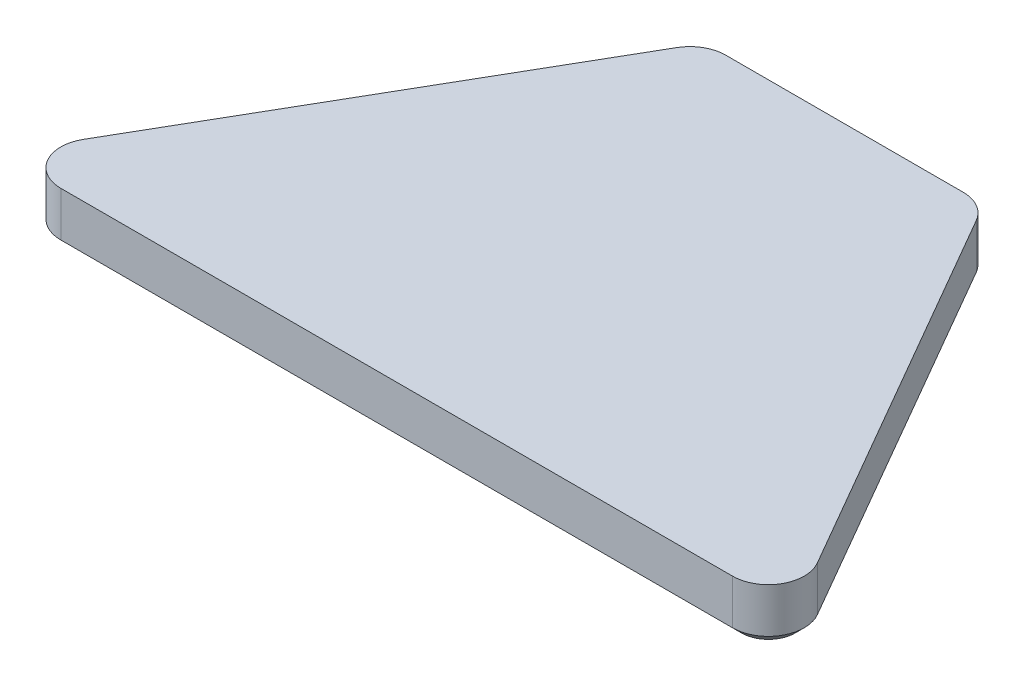
ISO-10303-21;
HEADER;
FILE_DESCRIPTION(('STEP AP214'),'2;1');
FILE_NAME('part.step','',(''),(''),'','','');
FILE_SCHEMA(('AUTOMOTIVE_DESIGN { 1 0 10303 214 1 1 1 1 }'));
ENDSEC;
DATA;
#1=APPLICATION_CONTEXT('core data for automotive mechanical design processes');
#2=APPLICATION_PROTOCOL_DEFINITION('international standard','automotive_design',2000,#1);
#3=PRODUCT_CONTEXT('',#1,'mechanical');
#4=PRODUCT('Part','Part','',(#3));
#5=PRODUCT_RELATED_PRODUCT_CATEGORY('part','',(#4));
#6=PRODUCT_DEFINITION_FORMATION('','',#4);
#7=PRODUCT_DEFINITION_CONTEXT('part definition',#1,'design');
#8=PRODUCT_DEFINITION('design','',#6,#7);
#9=PRODUCT_DEFINITION_SHAPE('','',#8);
#10=(LENGTH_UNIT() NAMED_UNIT(*) SI_UNIT(.MILLI.,.METRE.));
#11=(NAMED_UNIT(*) PLANE_ANGLE_UNIT() SI_UNIT($,.RADIAN.));
#12=(NAMED_UNIT(*) SI_UNIT($,.STERADIAN.) SOLID_ANGLE_UNIT());
#13=UNCERTAINTY_MEASURE_WITH_UNIT(LENGTH_MEASURE(1.E-05),#10,'distance_accuracy_value','');
#14=(GEOMETRIC_REPRESENTATION_CONTEXT(3) GLOBAL_UNCERTAINTY_ASSIGNED_CONTEXT((#13)) GLOBAL_UNIT_ASSIGNED_CONTEXT((#10,
#11,#12)) REPRESENTATION_CONTEXT('',''));
#15=CARTESIAN_POINT('',(0.,0.,0.));
#16=DIRECTION('',(0.,0.,1.));
#17=DIRECTION('',(1.,0.,0.));
#18=AXIS2_PLACEMENT_3D('',#15,#16,#17);
#19=CARTESIAN_POINT('',(22.2168783648704,1.5,12.5));
#20=DIRECTION('',(0.,0.,-1.));
#21=DIRECTION('',(-1.,0.,0.));
#22=AXIS2_PLACEMENT_3D('',#19,#20,#21);
#23=PLANE('',#22);
#24=DIRECTION('',(0.,-1.,0.));
#25=VECTOR('',#24,1.);
#26=CARTESIAN_POINT('',(-18.7527767497326,1.5,12.5));
#27=LINE('',#26,#25);
#28=CARTESIAN_POINT('',(-18.7527767497326,1.5,12.5));
#29=VERTEX_POINT('',#28);
#30=CARTESIAN_POINT('',(-18.7527767497326,-1.00000000000001,12.5));
#31=VERTEX_POINT('',#30);
#32=EDGE_CURVE('E177',#29,#31,#27,.T.);
#33=ORIENTED_EDGE('',*,*,#32,.T.);
#34=DIRECTION('',(1.,0.,0.));
#35=VECTOR('',#34,1.);
#36=CARTESIAN_POINT('',(18.7527767497326,-1.00000000000001,12.5));
#37=LINE('',#36,#35);
#38=CARTESIAN_POINT('',(18.7527767497326,-1.00000000000001,12.5));
#39=VERTEX_POINT('',#38);
#40=EDGE_CURVE('E213',#31,#39,#37,.T.);
#41=ORIENTED_EDGE('',*,*,#40,.T.);
#42=DIRECTION('',(0.,-1.,0.));
#43=VECTOR('',#42,1.);
#44=CARTESIAN_POINT('',(18.7527767497326,1.5,12.5));
#45=LINE('',#44,#43);
#46=CARTESIAN_POINT('',(18.7527767497326,1.5,12.5));
#47=VERTEX_POINT('',#46);
#48=EDGE_CURVE('E181',#39,#47,#45,.F.);
#49=ORIENTED_EDGE('',*,*,#48,.T.);
#50=DIRECTION('',(1.,0.,0.));
#51=VECTOR('',#50,1.);
#52=CARTESIAN_POINT('',(-22.2168783648704,1.5,12.5));
#53=LINE('',#52,#51);
#54=EDGE_CURVE('E258',#29,#47,#53,.T.);
#55=ORIENTED_EDGE('',*,*,#54,.F.);
#56=EDGE_LOOP('',(#33,#41,#49,#55));
#57=FACE_BOUND('',#56,.T.);
#58=ADVANCED_FACE('F39',(#57),#23,.F.);
#59=CARTESIAN_POINT('',(7.7831216351296,1.5,-12.5));
#60=DIRECTION('',(-0.866025403784436,0.,0.500000000000004));
#61=DIRECTION('',(0.500000000000004,0.,0.866025403784437));
#62=AXIS2_PLACEMENT_3D('',#59,#60,#61);
#63=PLANE('',#62);
#64=DIRECTION('',(0.,-1.,0.));
#65=VECTOR('',#64,1.);
#66=CARTESIAN_POINT('',(20.4848275573015,1.5,9.49999999999999));
#67=LINE('',#66,#65);
#68=CARTESIAN_POINT('',(20.4848275573015,1.5,9.49999999999998));
#69=VERTEX_POINT('',#68);
#70=CARTESIAN_POINT('',(20.4848275573015,-1.00000000000001,9.49999999999999));
#71=VERTEX_POINT('',#70);
#72=EDGE_CURVE('E140',#69,#71,#67,.T.);
#73=ORIENTED_EDGE('',*,*,#72,.T.);
#74=DIRECTION('',(-0.500000000000004,0.,-0.866025403784437));
#75=VECTOR('',#74,1.);
#76=CARTESIAN_POINT('',(8.36047190431923,-1.00000000000001,-11.5));
#77=LINE('',#76,#75);
#78=CARTESIAN_POINT('',(8.36047190431923,-1.00000000000001,-11.5));
#79=VERTEX_POINT('',#78);
#80=EDGE_CURVE('E219',#71,#79,#77,.T.);
#81=ORIENTED_EDGE('',*,*,#80,.T.);
#82=DIRECTION('',(0.,-1.,0.));
#83=VECTOR('',#82,1.);
#84=CARTESIAN_POINT('',(8.36047190431923,1.5,-11.5));
#85=LINE('',#84,#83);
#86=CARTESIAN_POINT('',(8.36047190431923,1.5,-11.5));
#87=VERTEX_POINT('',#86);
#88=EDGE_CURVE('E174',#79,#87,#85,.F.);
#89=ORIENTED_EDGE('',*,*,#88,.T.);
#90=DIRECTION('',(-0.500000000000004,0.,-0.866025403784436));
#91=VECTOR('',#90,1.);
#92=CARTESIAN_POINT('',(7.7831216351296,1.5,-12.5));
#93=LINE('',#92,#91);
#94=EDGE_CURVE('E265',#69,#87,#93,.T.);
#95=ORIENTED_EDGE('',*,*,#94,.F.);
#96=EDGE_LOOP('',(#73,#81,#89,#95));
#97=FACE_BOUND('',#96,.T.);
#98=ADVANCED_FACE('F319',(#97),#63,.F.);
#99=CARTESIAN_POINT('',(-7.7831216351296,1.5,-12.5));
#100=DIRECTION('',(0.,0.,1.));
#101=DIRECTION('',(1.,0.,0.));
#102=AXIS2_PLACEMENT_3D('',#99,#100,#101);
#103=PLANE('',#102);
#104=DIRECTION('',(0.,-1.,0.));
#105=VECTOR('',#104,1.);
#106=CARTESIAN_POINT('',(6.62842109675035,1.5,-12.5));
#107=LINE('',#106,#105);
#108=CARTESIAN_POINT('',(6.62842109675035,1.5,-12.5));
#109=VERTEX_POINT('',#108);
#110=CARTESIAN_POINT('',(6.62842109675035,-1.00000000000001,-12.5));
#111=VERTEX_POINT('',#110);
#112=EDGE_CURVE('E153',#109,#111,#107,.T.);
#113=ORIENTED_EDGE('',*,*,#112,.T.);
#114=DIRECTION('',(-1.,0.,0.));
#115=VECTOR('',#114,1.);
#116=CARTESIAN_POINT('',(-6.62842109675035,-1.00000000000001,-12.5));
#117=LINE('',#116,#115);
#118=CARTESIAN_POINT('',(-6.62842109675035,-1.00000000000001,-12.5));
#119=VERTEX_POINT('',#118);
#120=EDGE_CURVE('E64',#111,#119,#117,.T.);
#121=ORIENTED_EDGE('',*,*,#120,.T.);
#122=DIRECTION('',(0.,-1.,0.));
#123=VECTOR('',#122,1.);
#124=CARTESIAN_POINT('',(-6.62842109675035,1.5,-12.5));
#125=LINE('',#124,#123);
#126=CARTESIAN_POINT('',(-6.62842109675035,1.5,-12.5));
#127=VERTEX_POINT('',#126);
#128=EDGE_CURVE('E157',#119,#127,#125,.F.);
#129=ORIENTED_EDGE('',*,*,#128,.T.);
#130=DIRECTION('',(-1.,0.,0.));
#131=VECTOR('',#130,1.);
#132=CARTESIAN_POINT('',(-7.7831216351296,1.5,-12.5));
#133=LINE('',#132,#131);
#134=EDGE_CURVE('E138',#109,#127,#133,.T.);
#135=ORIENTED_EDGE('',*,*,#134,.F.);
#136=EDGE_LOOP('',(#113,#121,#129,#135));
#137=FACE_BOUND('',#136,.T.);
#138=ADVANCED_FACE('F283',(#137),#103,.F.);
#139=CARTESIAN_POINT('',(-7.7831216351296,1.5,-12.5));
#140=DIRECTION('',(0.866025403784436,0.,0.500000000000004));
#141=DIRECTION('',(0.500000000000004,0.,-0.866025403784436));
#142=AXIS2_PLACEMENT_3D('',#139,#140,#141);
#143=PLANE('',#142);
#144=DIRECTION('',(0.,-1.,0.));
#145=VECTOR('',#144,1.);
#146=CARTESIAN_POINT('',(-8.36047190431923,1.5,-11.5));
#147=LINE('',#146,#145);
#148=CARTESIAN_POINT('',(-8.36047190431923,1.5,-11.5));
#149=VERTEX_POINT('',#148);
#150=CARTESIAN_POINT('',(-8.36047190431923,-1.00000000000001,-11.5));
#151=VERTEX_POINT('',#150);
#152=EDGE_CURVE('E145',#149,#151,#147,.T.);
#153=ORIENTED_EDGE('',*,*,#152,.T.);
#154=DIRECTION('',(-0.500000000000004,0.,0.866025403784436));
#155=VECTOR('',#154,1.);
#156=CARTESIAN_POINT('',(-20.4848275573015,-1.00000000000001,9.49999999999999));
#157=LINE('',#156,#155);
#158=CARTESIAN_POINT('',(-20.4848275573015,-1.00000000000001,9.49999999999999));
#159=VERTEX_POINT('',#158);
#160=EDGE_CURVE('E11',#151,#159,#157,.T.);
#161=ORIENTED_EDGE('',*,*,#160,.T.);
#162=DIRECTION('',(0.,-1.,0.));
#163=VECTOR('',#162,1.);
#164=CARTESIAN_POINT('',(-20.4848275573015,1.5,9.49999999999999));
#165=LINE('',#164,#163);
#166=CARTESIAN_POINT('',(-20.4848275573015,1.5,9.49999999999999));
#167=VERTEX_POINT('',#166);
#168=EDGE_CURVE('E148',#159,#167,#165,.F.);
#169=ORIENTED_EDGE('',*,*,#168,.T.);
#170=DIRECTION('',(-0.500000000000004,0.,0.866025403784436));
#171=VECTOR('',#170,1.);
#172=CARTESIAN_POINT('',(-7.7831216351296,1.5,-12.5));
#173=LINE('',#172,#171);
#174=EDGE_CURVE('E135',#149,#167,#173,.T.);
#175=ORIENTED_EDGE('',*,*,#174,.F.);
#176=EDGE_LOOP('',(#153,#161,#169,#175));
#177=FACE_BOUND('',#176,.T.);
#178=ADVANCED_FACE('F144',(#177),#143,.F.);
#179=CARTESIAN_POINT('',(0.,1.5,0.));
#180=DIRECTION('',(0.,-1.,0.));
#181=DIRECTION('',(0.,0.,-1.));
#182=AXIS2_PLACEMENT_3D('',#179,#180,#181);
#183=PLANE('',#182);
#184=ORIENTED_EDGE('',*,*,#134,.T.);
#185=CARTESIAN_POINT('',(-6.62842109675035,1.5,-10.5));
#186=DIRECTION('',(0.,-1.,0.));
#187=DIRECTION('',(0.,0.,-1.));
#188=AXIS2_PLACEMENT_3D('',#185,#186,#187);
#189=CIRCLE('',#188,2.);
#190=EDGE_CURVE('E132',#127,#149,#189,.F.);
#191=ORIENTED_EDGE('',*,*,#190,.T.);
#192=ORIENTED_EDGE('',*,*,#174,.T.);
#193=CARTESIAN_POINT('',(-18.7527767497326,1.5,10.5));
#194=DIRECTION('',(0.,-1.,0.));
#195=DIRECTION('',(0.,0.,-1.));
#196=AXIS2_PLACEMENT_3D('',#193,#194,#195);
#197=CIRCLE('',#196,2.);
#198=EDGE_CURVE('E163',#167,#29,#197,.F.);
#199=ORIENTED_EDGE('',*,*,#198,.T.);
#200=ORIENTED_EDGE('',*,*,#54,.T.);
#201=CARTESIAN_POINT('',(18.7527767497326,1.5,10.5));
#202=DIRECTION('',(0.,-1.,0.));
#203=DIRECTION('',(0.,0.,-1.));
#204=AXIS2_PLACEMENT_3D('',#201,#202,#203);
#205=CIRCLE('',#204,2.);
#206=EDGE_CURVE('E166',#47,#69,#205,.F.);
#207=ORIENTED_EDGE('',*,*,#206,.T.);
#208=ORIENTED_EDGE('',*,*,#94,.T.);
#209=CARTESIAN_POINT('',(6.62842109675035,1.5,-10.5));
#210=DIRECTION('',(0.,-1.,0.));
#211=DIRECTION('',(0.,0.,-1.));
#212=AXIS2_PLACEMENT_3D('',#209,#210,#211);
#213=CIRCLE('',#212,2.);
#214=EDGE_CURVE('E141',#87,#109,#213,.F.);
#215=ORIENTED_EDGE('',*,*,#214,.T.);
#216=EDGE_LOOP('',(#184,#191,#192,#199,#200,#207,#208,#215));
#217=FACE_BOUND('',#216,.T.);
#218=ADVANCED_FACE('F134',(#217),#183,.F.);
#219=CARTESIAN_POINT('',(0.,-1.5,0.));
#220=DIRECTION('',(0.,-1.,0.));
#221=DIRECTION('',(0.,0.,-1.));
#222=AXIS2_PLACEMENT_3D('',#219,#220,#221);
#223=PLANE('',#222);
#224=DIRECTION('',(-1.,0.,0.));
#225=VECTOR('',#224,1.);
#226=CARTESIAN_POINT('',(-18.7527767497326,-1.5,12.));
#227=LINE('',#226,#225);
#228=CARTESIAN_POINT('',(18.7527767497326,-1.5,12.));
#229=VERTEX_POINT('',#228);
#230=CARTESIAN_POINT('',(-18.7527767497326,-1.5,12.));
#231=VERTEX_POINT('',#230);
#232=EDGE_CURVE('E202',#229,#231,#227,.T.);
#233=ORIENTED_EDGE('',*,*,#232,.T.);
#234=CARTESIAN_POINT('',(-18.7527767497326,-1.5,10.5));
#235=DIRECTION('',(0.,-1.,0.));
#236=DIRECTION('',(0.,0.,-1.));
#237=AXIS2_PLACEMENT_3D('',#234,#235,#236);
#238=CIRCLE('',#237,1.5);
#239=CARTESIAN_POINT('',(-20.0518148554093,-1.5,9.75));
#240=VERTEX_POINT('',#239);
#241=EDGE_CURVE('E205',#231,#240,#238,.T.);
#242=ORIENTED_EDGE('',*,*,#241,.T.);
#243=DIRECTION('',(0.500000000000004,0.,-0.866025403784436));
#244=VECTOR('',#243,1.);
#245=CARTESIAN_POINT('',(-7.92745920242701,-1.5,-11.25));
#246=LINE('',#245,#244);
#247=CARTESIAN_POINT('',(-7.92745920242701,-1.5,-11.25));
#248=VERTEX_POINT('',#247);
#249=EDGE_CURVE('E184',#240,#248,#246,.T.);
#250=ORIENTED_EDGE('',*,*,#249,.T.);
#251=CARTESIAN_POINT('',(-6.62842109675035,-1.5,-10.5));
#252=DIRECTION('',(0.,-1.,0.));
#253=DIRECTION('',(0.,0.,-1.));
#254=AXIS2_PLACEMENT_3D('',#251,#252,#253);
#255=CIRCLE('',#254,1.5);
#256=CARTESIAN_POINT('',(-6.62842109675035,-1.5,-12.));
#257=VERTEX_POINT('',#256);
#258=EDGE_CURVE('E187',#248,#257,#255,.T.);
#259=ORIENTED_EDGE('',*,*,#258,.T.);
#260=DIRECTION('',(1.,0.,0.));
#261=VECTOR('',#260,1.);
#262=CARTESIAN_POINT('',(6.62842109675035,-1.5,-12.));
#263=LINE('',#262,#261);
#264=CARTESIAN_POINT('',(6.62842109675035,-1.5,-12.));
#265=VERTEX_POINT('',#264);
#266=EDGE_CURVE('E190',#257,#265,#263,.T.);
#267=ORIENTED_EDGE('',*,*,#266,.T.);
#268=CARTESIAN_POINT('',(6.62842109675035,-1.5,-10.5));
#269=DIRECTION('',(0.,-1.,0.));
#270=DIRECTION('',(0.,0.,-1.));
#271=AXIS2_PLACEMENT_3D('',#268,#269,#270);
#272=CIRCLE('',#271,1.5);
#273=CARTESIAN_POINT('',(7.92745920242701,-1.5,-11.25));
#274=VERTEX_POINT('',#273);
#275=EDGE_CURVE('E193',#265,#274,#272,.T.);
#276=ORIENTED_EDGE('',*,*,#275,.T.);
#277=DIRECTION('',(0.500000000000004,0.,0.866025403784437));
#278=VECTOR('',#277,1.);
#279=CARTESIAN_POINT('',(20.0518148554093,-1.5,9.74999999999998));
#280=LINE('',#279,#278);
#281=CARTESIAN_POINT('',(20.0518148554093,-1.5,9.74999999999999));
#282=VERTEX_POINT('',#281);
#283=EDGE_CURVE('E196',#274,#282,#280,.T.);
#284=ORIENTED_EDGE('',*,*,#283,.T.);
#285=CARTESIAN_POINT('',(18.7527767497326,-1.5,10.5));
#286=DIRECTION('',(0.,-1.,0.));
#287=DIRECTION('',(0.,0.,-1.));
#288=AXIS2_PLACEMENT_3D('',#285,#286,#287);
#289=CIRCLE('',#288,1.5);
#290=EDGE_CURVE('E199',#282,#229,#289,.T.);
#291=ORIENTED_EDGE('',*,*,#290,.T.);
#292=EDGE_LOOP('',(#233,#242,#250,#259,#267,#276,#284,#291));
#293=FACE_BOUND('',#292,.T.);
#294=ADVANCED_FACE('F332',(#293),#223,.T.);
#295=CARTESIAN_POINT('',(-6.62842109675035,1.5,-10.5));
#296=DIRECTION('',(0.,-1.,0.));
#297=DIRECTION('',(0.,0.,-1.));
#298=AXIS2_PLACEMENT_3D('',#295,#296,#297);
#299=CYLINDRICAL_SURFACE('',#298,2.);
#300=ORIENTED_EDGE('',*,*,#128,.F.);
#301=CARTESIAN_POINT('',(-6.62842109675035,-1.00000000000001,-10.5));
#302=DIRECTION('',(0.,-1.,0.));
#303=DIRECTION('',(0.,0.,-1.));
#304=AXIS2_PLACEMENT_3D('',#301,#302,#303);
#305=CIRCLE('',#304,2.);
#306=EDGE_CURVE('E49',#119,#151,#305,.F.);
#307=ORIENTED_EDGE('',*,*,#306,.T.);
#308=ORIENTED_EDGE('',*,*,#152,.F.);
#309=ORIENTED_EDGE('',*,*,#190,.F.);
#310=EDGE_LOOP('',(#300,#307,#308,#309));
#311=FACE_BOUND('',#310,.T.);
#312=ADVANCED_FACE('F151',(#311),#299,.T.);
#313=CARTESIAN_POINT('',(6.62842109675035,1.5,-10.5));
#314=DIRECTION('',(0.,-1.,0.));
#315=DIRECTION('',(0.,0.,-1.));
#316=AXIS2_PLACEMENT_3D('',#313,#314,#315);
#317=CYLINDRICAL_SURFACE('',#316,2.);
#318=ORIENTED_EDGE('',*,*,#88,.F.);
#319=CARTESIAN_POINT('',(6.62842109675035,-1.00000000000001,-10.5));
#320=DIRECTION('',(0.,-1.,0.));
#321=DIRECTION('',(0.,0.,-1.));
#322=AXIS2_PLACEMENT_3D('',#319,#320,#321);
#323=CIRCLE('',#322,2.);
#324=EDGE_CURVE('E222',#79,#111,#323,.F.);
#325=ORIENTED_EDGE('',*,*,#324,.T.);
#326=ORIENTED_EDGE('',*,*,#112,.F.);
#327=ORIENTED_EDGE('',*,*,#214,.F.);
#328=EDGE_LOOP('',(#318,#325,#326,#327));
#329=FACE_BOUND('',#328,.T.);
#330=ADVANCED_FACE('F281',(#329),#317,.T.);
#331=CARTESIAN_POINT('',(18.7527767497326,1.5,10.5));
#332=DIRECTION('',(0.,-1.,0.));
#333=DIRECTION('',(0.,0.,-1.));
#334=AXIS2_PLACEMENT_3D('',#331,#332,#333);
#335=CYLINDRICAL_SURFACE('',#334,2.);
#336=ORIENTED_EDGE('',*,*,#48,.F.);
#337=CARTESIAN_POINT('',(18.7527767497326,-1.00000000000001,10.5));
#338=DIRECTION('',(0.,-1.,0.));
#339=DIRECTION('',(0.,0.,-1.));
#340=AXIS2_PLACEMENT_3D('',#337,#338,#339);
#341=CIRCLE('',#340,2.);
#342=EDGE_CURVE('E216',#39,#71,#341,.F.);
#343=ORIENTED_EDGE('',*,*,#342,.T.);
#344=ORIENTED_EDGE('',*,*,#72,.F.);
#345=ORIENTED_EDGE('',*,*,#206,.F.);
#346=EDGE_LOOP('',(#336,#343,#344,#345));
#347=FACE_BOUND('',#346,.T.);
#348=ADVANCED_FACE('F313',(#347),#335,.T.);
#349=CARTESIAN_POINT('',(-18.7527767497326,1.5,10.5));
#350=DIRECTION('',(0.,-1.,0.));
#351=DIRECTION('',(0.,0.,-1.));
#352=AXIS2_PLACEMENT_3D('',#349,#350,#351);
#353=CYLINDRICAL_SURFACE('',#352,2.);
#354=ORIENTED_EDGE('',*,*,#168,.F.);
#355=CARTESIAN_POINT('',(-18.7527767497326,-1.00000000000001,10.5));
#356=DIRECTION('',(0.,-1.,0.));
#357=DIRECTION('',(0.,0.,-1.));
#358=AXIS2_PLACEMENT_3D('',#355,#356,#357);
#359=CIRCLE('',#358,2.);
#360=EDGE_CURVE('E209',#159,#31,#359,.F.);
#361=ORIENTED_EDGE('',*,*,#360,.T.);
#362=ORIENTED_EDGE('',*,*,#32,.F.);
#363=ORIENTED_EDGE('',*,*,#198,.F.);
#364=EDGE_LOOP('',(#354,#361,#362,#363));
#365=FACE_BOUND('',#364,.T.);
#366=ADVANCED_FACE('F298',(#365),#353,.T.);
#367=CARTESIAN_POINT('',(6.62842109675035,-1.5,-10.5));
#368=DIRECTION('',(0.,1.,0.));
#369=DIRECTION('',(0.,0.,1.));
#370=AXIS2_PLACEMENT_3D('',#367,#368,#369);
#371=CONICAL_SURFACE('',#370,1.5,0.785398163397453);
#372=DIRECTION('',(0.,-0.707106781186544,0.707106781186551));
#373=VECTOR('',#372,1.);
#374=CARTESIAN_POINT('',(6.62842109675035,-1.00000000000001,-12.5));
#375=LINE('',#374,#373);
#376=EDGE_CURVE('E250',#111,#265,#375,.T.);
#377=ORIENTED_EDGE('',*,*,#376,.F.);
#378=ORIENTED_EDGE('',*,*,#324,.F.);
#379=DIRECTION('',(0.612372435695797,0.707106781186543,-0.353553390593279));
#380=VECTOR('',#379,1.);
#381=CARTESIAN_POINT('',(7.92745920242701,-1.5,-11.25));
#382=LINE('',#381,#380);
#383=EDGE_CURVE('E43',#274,#79,#382,.T.);
#384=ORIENTED_EDGE('',*,*,#383,.F.);
#385=ORIENTED_EDGE('',*,*,#275,.F.);
#386=EDGE_LOOP('',(#377,#378,#384,#385));
#387=FACE_BOUND('',#386,.T.);
#388=ADVANCED_FACE('F41',(#387),#371,.T.);
#389=CARTESIAN_POINT('',(7.7831216351296,-1.00000000000001,-12.5));
#390=DIRECTION('',(0.612372435695789,-0.707106781186552,-0.353553390593274));
#391=DIRECTION('',(0.500000000000004,0.,0.866025403784437));
#392=AXIS2_PLACEMENT_3D('',#389,#390,#391);
#393=PLANE('',#392);
#394=ORIENTED_EDGE('',*,*,#383,.T.);
#395=ORIENTED_EDGE('',*,*,#80,.F.);
#396=DIRECTION('',(0.612372435695797,0.707106781186543,-0.353553390593279));
#397=VECTOR('',#396,1.);
#398=CARTESIAN_POINT('',(20.0518148554093,-1.5,9.74999999999999));
#399=LINE('',#398,#397);
#400=EDGE_CURVE('E247',#282,#71,#399,.T.);
#401=ORIENTED_EDGE('',*,*,#400,.F.);
#402=ORIENTED_EDGE('',*,*,#283,.F.);
#403=EDGE_LOOP('',(#394,#395,#401,#402));
#404=FACE_BOUND('',#403,.T.);
#405=ADVANCED_FACE('F318',(#404),#393,.T.);
#406=CARTESIAN_POINT('',(-7.7831216351296,-1.00000000000001,-12.5));
#407=DIRECTION('',(0.,-0.707106781186551,-0.707106781186544));
#408=DIRECTION('',(1.,0.,0.));
#409=AXIS2_PLACEMENT_3D('',#406,#407,#408);
#410=PLANE('',#409);
#411=ORIENTED_EDGE('',*,*,#376,.T.);
#412=ORIENTED_EDGE('',*,*,#266,.F.);
#413=DIRECTION('',(0.,-0.707106781186544,0.707106781186551));
#414=VECTOR('',#413,1.);
#415=CARTESIAN_POINT('',(-6.62842109675035,-1.00000000000001,-12.5));
#416=LINE('',#415,#414);
#417=EDGE_CURVE('E243',#119,#257,#416,.T.);
#418=ORIENTED_EDGE('',*,*,#417,.F.);
#419=ORIENTED_EDGE('',*,*,#120,.F.);
#420=EDGE_LOOP('',(#411,#412,#418,#419));
#421=FACE_BOUND('',#420,.T.);
#422=ADVANCED_FACE('F287',(#421),#410,.T.);
#423=CARTESIAN_POINT('',(18.7527767497326,-1.5,10.5));
#424=DIRECTION('',(0.,1.,0.));
#425=DIRECTION('',(0.,0.,1.));
#426=AXIS2_PLACEMENT_3D('',#423,#424,#425);
#427=CONICAL_SURFACE('',#426,1.5,0.785398163397455);
#428=ORIENTED_EDGE('',*,*,#400,.T.);
#429=ORIENTED_EDGE('',*,*,#342,.F.);
#430=DIRECTION('',(0.,0.707106781186543,0.707106781186552));
#431=VECTOR('',#430,1.);
#432=CARTESIAN_POINT('',(18.7527767497326,-1.5,12.));
#433=LINE('',#432,#431);
#434=EDGE_CURVE('E239',#229,#39,#433,.T.);
#435=ORIENTED_EDGE('',*,*,#434,.F.);
#436=ORIENTED_EDGE('',*,*,#290,.F.);
#437=EDGE_LOOP('',(#428,#429,#435,#436));
#438=FACE_BOUND('',#437,.T.);
#439=ADVANCED_FACE('F315',(#438),#427,.T.);
#440=CARTESIAN_POINT('',(-6.62842109675035,-1.5,-10.5));
#441=DIRECTION('',(0.,1.,0.));
#442=DIRECTION('',(0.,0.,1.));
#443=AXIS2_PLACEMENT_3D('',#440,#441,#442);
#444=CONICAL_SURFACE('',#443,1.5,0.785398163397454);
#445=ORIENTED_EDGE('',*,*,#417,.T.);
#446=ORIENTED_EDGE('',*,*,#258,.F.);
#447=DIRECTION('',(0.612372435695797,-0.707106781186543,0.353553390593279));
#448=VECTOR('',#447,1.);
#449=CARTESIAN_POINT('',(-8.36047190431923,-1.00000000000001,-11.5));
#450=LINE('',#449,#448);
#451=EDGE_CURVE('E235',#151,#248,#450,.T.);
#452=ORIENTED_EDGE('',*,*,#451,.F.);
#453=ORIENTED_EDGE('',*,*,#306,.F.);
#454=EDGE_LOOP('',(#445,#446,#452,#453));
#455=FACE_BOUND('',#454,.T.);
#456=ADVANCED_FACE('F290',(#455),#444,.T.);
#457=CARTESIAN_POINT('',(22.2168783648704,-1.00000000000001,12.5));
#458=DIRECTION('',(0.,-0.707106781186551,0.707106781186544));
#459=DIRECTION('',(-1.,0.,0.));
#460=AXIS2_PLACEMENT_3D('',#457,#458,#459);
#461=PLANE('',#460);
#462=ORIENTED_EDGE('',*,*,#434,.T.);
#463=ORIENTED_EDGE('',*,*,#40,.F.);
#464=DIRECTION('',(0.,0.707106781186544,0.707106781186551));
#465=VECTOR('',#464,1.);
#466=CARTESIAN_POINT('',(-18.7527767497326,-1.5,12.));
#467=LINE('',#466,#465);
#468=EDGE_CURVE('E232',#231,#31,#467,.T.);
#469=ORIENTED_EDGE('',*,*,#468,.F.);
#470=ORIENTED_EDGE('',*,*,#232,.F.);
#471=EDGE_LOOP('',(#462,#463,#469,#470));
#472=FACE_BOUND('',#471,.T.);
#473=ADVANCED_FACE('F307',(#472),#461,.T.);
#474=CARTESIAN_POINT('',(-7.7831216351296,-1.00000000000001,-12.5));
#475=DIRECTION('',(-0.612372435695789,-0.707106781186552,-0.353553390593275));
#476=DIRECTION('',(0.500000000000004,0.,-0.866025403784436));
#477=AXIS2_PLACEMENT_3D('',#474,#475,#476);
#478=PLANE('',#477);
#479=ORIENTED_EDGE('',*,*,#451,.T.);
#480=ORIENTED_EDGE('',*,*,#249,.F.);
#481=DIRECTION('',(0.612372435695797,-0.707106781186543,0.353553390593279));
#482=VECTOR('',#481,1.);
#483=CARTESIAN_POINT('',(-20.4848275573015,-1.00000000000001,9.49999999999999));
#484=LINE('',#483,#482);
#485=EDGE_CURVE('E229',#159,#240,#484,.T.);
#486=ORIENTED_EDGE('',*,*,#485,.F.);
#487=ORIENTED_EDGE('',*,*,#160,.F.);
#488=EDGE_LOOP('',(#479,#480,#486,#487));
#489=FACE_BOUND('',#488,.T.);
#490=ADVANCED_FACE('F295',(#489),#478,.T.);
#491=CARTESIAN_POINT('',(-18.7527767497326,-1.5,10.5));
#492=DIRECTION('',(0.,1.,0.));
#493=DIRECTION('',(0.,0.,1.));
#494=AXIS2_PLACEMENT_3D('',#491,#492,#493);
#495=CONICAL_SURFACE('',#494,1.5,0.785398163397453);
#496=ORIENTED_EDGE('',*,*,#468,.T.);
#497=ORIENTED_EDGE('',*,*,#360,.F.);
#498=ORIENTED_EDGE('',*,*,#485,.T.);
#499=ORIENTED_EDGE('',*,*,#241,.F.);
#500=EDGE_LOOP('',(#496,#497,#498,#499));
#501=FACE_BOUND('',#500,.T.);
#502=ADVANCED_FACE('F301',(#501),#495,.T.);
#503=CLOSED_SHELL('',(#58,#98,#138,#178,#218,#294,#312,#330,#348,#366,#388,#405,#422,#439,#456,
#473,#490,#502));
#504=MANIFOLD_SOLID_BREP('B2',#503);
#505=ADVANCED_BREP_SHAPE_REPRESENTATION('',(#18,#504),#14);
#506=SHAPE_DEFINITION_REPRESENTATION(#9,#505);
ENDSEC;
END-ISO-10303-21;
